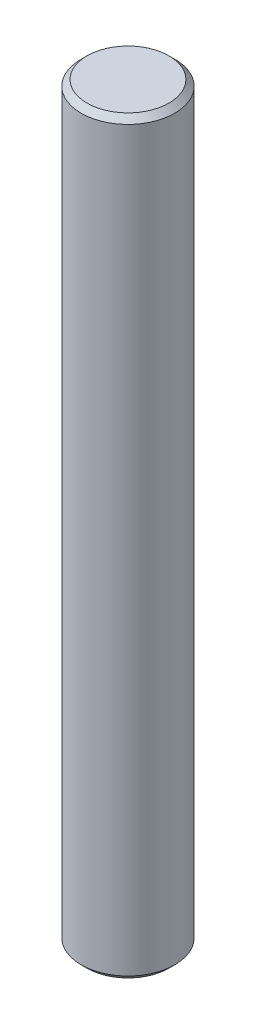
ISO-10303-21;
HEADER;
FILE_DESCRIPTION(('STEP AP214'),'2;1');
FILE_NAME('part.step','',(''),(''),'','','');
FILE_SCHEMA(('AUTOMOTIVE_DESIGN { 1 0 10303 214 1 1 1 1 }'));
ENDSEC;
DATA;
#1=APPLICATION_CONTEXT('core data for automotive mechanical design processes');
#2=APPLICATION_PROTOCOL_DEFINITION('international standard','automotive_design',2000,#1);
#3=PRODUCT_CONTEXT('',#1,'mechanical');
#4=PRODUCT('Part','Part','',(#3));
#5=PRODUCT_RELATED_PRODUCT_CATEGORY('part','',(#4));
#6=PRODUCT_DEFINITION_FORMATION('','',#4);
#7=PRODUCT_DEFINITION_CONTEXT('part definition',#1,'design');
#8=PRODUCT_DEFINITION('design','',#6,#7);
#9=PRODUCT_DEFINITION_SHAPE('','',#8);
#10=(LENGTH_UNIT() NAMED_UNIT(*) SI_UNIT(.MILLI.,.METRE.));
#11=(NAMED_UNIT(*) PLANE_ANGLE_UNIT() SI_UNIT($,.RADIAN.));
#12=(NAMED_UNIT(*) SI_UNIT($,.STERADIAN.) SOLID_ANGLE_UNIT());
#13=UNCERTAINTY_MEASURE_WITH_UNIT(LENGTH_MEASURE(1.E-05),#10,'distance_accuracy_value','');
#14=(GEOMETRIC_REPRESENTATION_CONTEXT(3) GLOBAL_UNCERTAINTY_ASSIGNED_CONTEXT((#13)) GLOBAL_UNIT_ASSIGNED_CONTEXT((#10,
#11,#12)) REPRESENTATION_CONTEXT('',''));
#15=CARTESIAN_POINT('',(0.,0.,0.));
#16=DIRECTION('',(0.,0.,1.));
#17=DIRECTION('',(1.,0.,0.));
#18=AXIS2_PLACEMENT_3D('',#15,#16,#17);
#19=CARTESIAN_POINT('',(0.,16.,0.));
#20=DIRECTION('',(0.,-1.,0.));
#21=DIRECTION('',(0.,0.,-1.));
#22=AXIS2_PLACEMENT_3D('',#19,#20,#21);
#23=CYLINDRICAL_SURFACE('',#22,2.);
#24=CARTESIAN_POINT('',(0.,-15.75,0.));
#25=DIRECTION('',(0.,1.,0.));
#26=DIRECTION('',(0.,0.,1.));
#27=AXIS2_PLACEMENT_3D('',#24,#25,#26);
#28=CIRCLE('',#27,2.);
#29=CARTESIAN_POINT('',(0.,-15.75,2.));
#30=VERTEX_POINT('',#29);
#31=EDGE_CURVE('E49',#30,#30,#28,.T.);
#32=ORIENTED_EDGE('',*,*,#31,.T.);
#33=EDGE_LOOP('',(#32));
#34=FACE_BOUND('',#33,.T.);
#35=CARTESIAN_POINT('',(0.,15.75,0.));
#36=DIRECTION('',(0.,1.,0.));
#37=DIRECTION('',(0.,0.,1.));
#38=AXIS2_PLACEMENT_3D('',#35,#36,#37);
#39=CIRCLE('',#38,2.);
#40=CARTESIAN_POINT('',(0.,15.75,2.));
#41=VERTEX_POINT('',#40);
#42=EDGE_CURVE('E53',#41,#41,#39,.F.);
#43=ORIENTED_EDGE('',*,*,#42,.T.);
#44=EDGE_LOOP('',(#43));
#45=FACE_BOUND('',#44,.T.);
#46=ADVANCED_FACE('F37',(#34,#45),#23,.T.);
#47=CARTESIAN_POINT('',(0.,16.,0.));
#48=DIRECTION('',(0.,1.,0.));
#49=DIRECTION('',(0.,0.,1.));
#50=AXIS2_PLACEMENT_3D('',#47,#48,#49);
#51=PLANE('',#50);
#52=CARTESIAN_POINT('',(0.,16.,0.));
#53=DIRECTION('',(0.,1.,0.));
#54=DIRECTION('',(0.,0.,1.));
#55=AXIS2_PLACEMENT_3D('',#52,#53,#54);
#56=CIRCLE('',#55,1.75);
#57=CARTESIAN_POINT('',(0.,16.,1.75));
#58=VERTEX_POINT('',#57);
#59=EDGE_CURVE('E10',#58,#58,#56,.T.);
#60=ORIENTED_EDGE('',*,*,#59,.T.);
#61=EDGE_LOOP('',(#60));
#62=FACE_BOUND('',#61,.T.);
#63=ADVANCED_FACE('F69',(#62),#51,.T.);
#64=CARTESIAN_POINT('',(0.,-16.,0.));
#65=DIRECTION('',(0.,1.,0.));
#66=DIRECTION('',(0.,0.,1.));
#67=AXIS2_PLACEMENT_3D('',#64,#65,#66);
#68=PLANE('',#67);
#69=CARTESIAN_POINT('',(0.,-16.,0.));
#70=DIRECTION('',(0.,1.,0.));
#71=DIRECTION('',(0.,0.,1.));
#72=AXIS2_PLACEMENT_3D('',#69,#70,#71);
#73=CIRCLE('',#72,1.75);
#74=CARTESIAN_POINT('',(0.,-16.,1.75));
#75=VERTEX_POINT('',#74);
#76=EDGE_CURVE('E45',#75,#75,#73,.F.);
#77=ORIENTED_EDGE('',*,*,#76,.T.);
#78=EDGE_LOOP('',(#77));
#79=FACE_BOUND('',#78,.T.);
#80=ADVANCED_FACE('F66',(#79),#68,.F.);
#81=CARTESIAN_POINT('',(0.,-15.75,0.));
#82=DIRECTION('',(0.,1.,0.));
#83=DIRECTION('',(0.,0.,1.));
#84=AXIS2_PLACEMENT_3D('',#81,#82,#83);
#85=CONICAL_SURFACE('',#84,2.,0.785398163397445);
#86=ORIENTED_EDGE('',*,*,#76,.F.);
#87=EDGE_LOOP('',(#86));
#88=FACE_BOUND('',#87,.T.);
#89=ORIENTED_EDGE('',*,*,#31,.F.);
#90=EDGE_LOOP('',(#89));
#91=FACE_BOUND('',#90,.T.);
#92=ADVANCED_FACE('F62',(#88,#91),#85,.T.);
#93=CARTESIAN_POINT('',(0.,16.,0.));
#94=DIRECTION('',(0.,-1.,0.));
#95=DIRECTION('',(0.,0.,-1.));
#96=AXIS2_PLACEMENT_3D('',#93,#94,#95);
#97=CONICAL_SURFACE('',#96,1.75,0.785398163397452);
#98=ORIENTED_EDGE('',*,*,#42,.F.);
#99=EDGE_LOOP('',(#98));
#100=FACE_BOUND('',#99,.T.);
#101=ORIENTED_EDGE('',*,*,#59,.F.);
#102=EDGE_LOOP('',(#101));
#103=FACE_BOUND('',#102,.T.);
#104=ADVANCED_FACE('F40',(#100,#103),#97,.T.);
#105=CLOSED_SHELL('',(#46,#63,#80,#92,#104));
#106=MANIFOLD_SOLID_BREP('B2',#105);
#107=ADVANCED_BREP_SHAPE_REPRESENTATION('',(#18,#106),#14);
#108=SHAPE_DEFINITION_REPRESENTATION(#9,#107);
ENDSEC;
END-ISO-10303-21;
